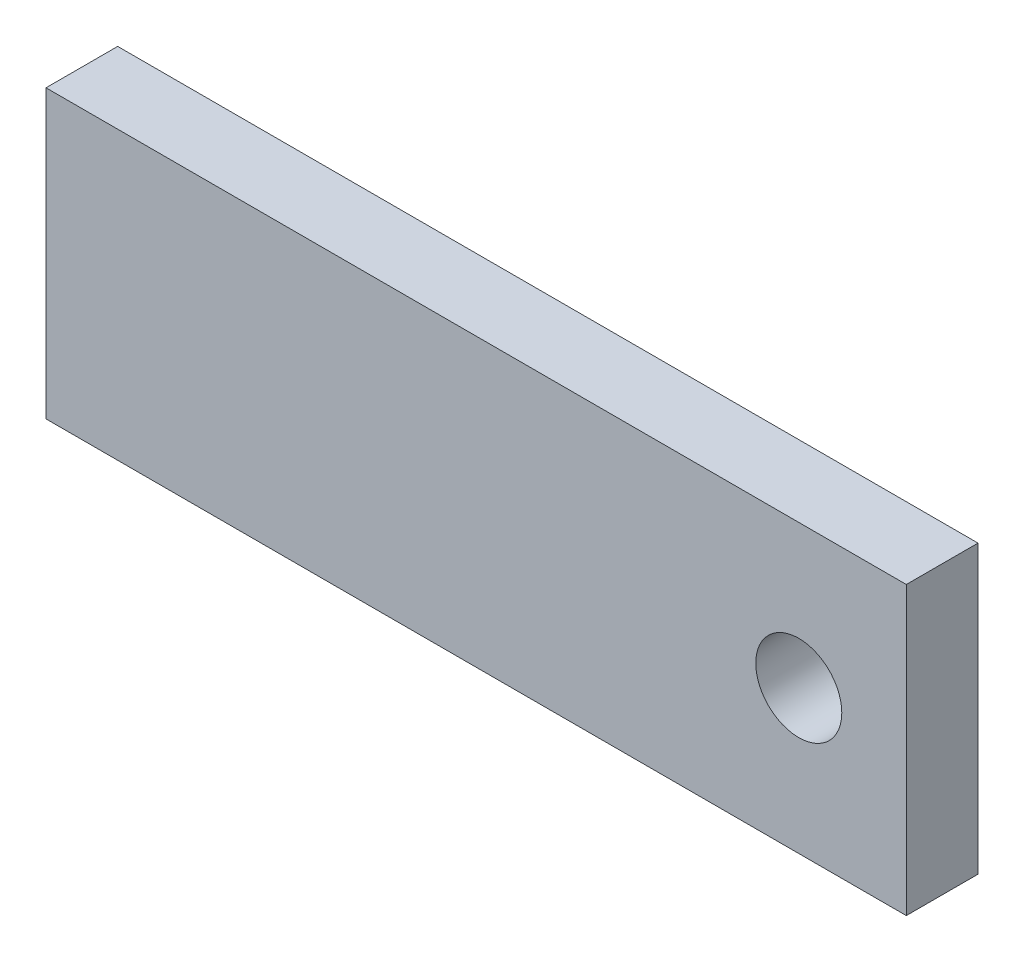
ISO-10303-21;
HEADER;
FILE_DESCRIPTION(('STEP AP214'),'2;1');
FILE_NAME('part.step','',(''),(''),'','','');
FILE_SCHEMA(('AUTOMOTIVE_DESIGN { 1 0 10303 214 1 1 1 1 }'));
ENDSEC;
DATA;
#1=APPLICATION_CONTEXT('core data for automotive mechanical design processes');
#2=APPLICATION_PROTOCOL_DEFINITION('international standard','automotive_design',2000,#1);
#3=PRODUCT_CONTEXT('',#1,'mechanical');
#4=PRODUCT('Part','Part','',(#3));
#5=PRODUCT_RELATED_PRODUCT_CATEGORY('part','',(#4));
#6=PRODUCT_DEFINITION_FORMATION('','',#4);
#7=PRODUCT_DEFINITION_CONTEXT('part definition',#1,'design');
#8=PRODUCT_DEFINITION('design','',#6,#7);
#9=PRODUCT_DEFINITION_SHAPE('','',#8);
#10=(LENGTH_UNIT() NAMED_UNIT(*) SI_UNIT(.MILLI.,.METRE.));
#11=(NAMED_UNIT(*) PLANE_ANGLE_UNIT() SI_UNIT($,.RADIAN.));
#12=(NAMED_UNIT(*) SI_UNIT($,.STERADIAN.) SOLID_ANGLE_UNIT());
#13=UNCERTAINTY_MEASURE_WITH_UNIT(LENGTH_MEASURE(1.E-05),#10,'distance_accuracy_value','');
#14=(GEOMETRIC_REPRESENTATION_CONTEXT(3) GLOBAL_UNCERTAINTY_ASSIGNED_CONTEXT((#13)) GLOBAL_UNIT_ASSIGNED_CONTEXT((#10,
#11,#12)) REPRESENTATION_CONTEXT('',''));
#15=CARTESIAN_POINT('',(0.,0.,0.));
#16=DIRECTION('',(0.,0.,1.));
#17=DIRECTION('',(1.,0.,0.));
#18=AXIS2_PLACEMENT_3D('',#15,#16,#17);
#19=CARTESIAN_POINT('',(0.,20.,10.));
#20=DIRECTION('',(1.,0.,0.));
#21=DIRECTION('',(0.,0.,-1.));
#22=AXIS2_PLACEMENT_3D('',#19,#20,#21);
#23=PLANE('',#22);
#24=DIRECTION('',(0.,-1.,0.));
#25=VECTOR('',#24,1.);
#26=CARTESIAN_POINT('',(0.,20.,0.));
#27=LINE('',#26,#25);
#28=CARTESIAN_POINT('',(0.,20.,0.));
#29=VERTEX_POINT('',#28);
#30=CARTESIAN_POINT('',(0.,-20.,0.));
#31=VERTEX_POINT('',#30);
#32=EDGE_CURVE('E96',#29,#31,#27,.T.);
#33=ORIENTED_EDGE('',*,*,#32,.T.);
#34=DIRECTION('',(0.,0.,-1.));
#35=VECTOR('',#34,1.);
#36=CARTESIAN_POINT('',(0.,-20.,10.));
#37=LINE('',#36,#35);
#38=CARTESIAN_POINT('',(0.,-20.,10.));
#39=VERTEX_POINT('',#38);
#40=EDGE_CURVE('E11',#39,#31,#37,.T.);
#41=ORIENTED_EDGE('',*,*,#40,.F.);
#42=DIRECTION('',(0.,-1.,0.));
#43=VECTOR('',#42,1.);
#44=CARTESIAN_POINT('',(0.,20.,10.));
#45=LINE('',#44,#43);
#46=CARTESIAN_POINT('',(0.,20.,10.));
#47=VERTEX_POINT('',#46);
#48=EDGE_CURVE('E84',#47,#39,#45,.T.);
#49=ORIENTED_EDGE('',*,*,#48,.F.);
#50=DIRECTION('',(0.,0.,-1.));
#51=VECTOR('',#50,1.);
#52=CARTESIAN_POINT('',(0.,20.,10.));
#53=LINE('',#52,#51);
#54=EDGE_CURVE('E92',#47,#29,#53,.T.);
#55=ORIENTED_EDGE('',*,*,#54,.T.);
#56=EDGE_LOOP('',(#33,#41,#49,#55));
#57=FACE_BOUND('',#56,.T.);
#58=ADVANCED_FACE('F33',(#57),#23,.F.);
#59=CARTESIAN_POINT('',(0.,-20.,10.));
#60=DIRECTION('',(0.,1.,0.));
#61=DIRECTION('',(0.,0.,1.));
#62=AXIS2_PLACEMENT_3D('',#59,#60,#61);
#63=PLANE('',#62);
#64=DIRECTION('',(1.,0.,0.));
#65=VECTOR('',#64,1.);
#66=CARTESIAN_POINT('',(0.,-20.,0.));
#67=LINE('',#66,#65);
#68=CARTESIAN_POINT('',(120.,-20.,0.));
#69=VERTEX_POINT('',#68);
#70=EDGE_CURVE('E88',#31,#69,#67,.T.);
#71=ORIENTED_EDGE('',*,*,#70,.T.);
#72=DIRECTION('',(0.,0.,-1.));
#73=VECTOR('',#72,1.);
#74=CARTESIAN_POINT('',(120.,-20.,10.));
#75=LINE('',#74,#73);
#76=CARTESIAN_POINT('',(120.,-20.,10.));
#77=VERTEX_POINT('',#76);
#78=EDGE_CURVE('E41',#77,#69,#75,.T.);
#79=ORIENTED_EDGE('',*,*,#78,.F.);
#80=DIRECTION('',(1.,0.,0.));
#81=VECTOR('',#80,1.);
#82=CARTESIAN_POINT('',(0.,-20.,10.));
#83=LINE('',#82,#81);
#84=EDGE_CURVE('E79',#39,#77,#83,.T.);
#85=ORIENTED_EDGE('',*,*,#84,.F.);
#86=ORIENTED_EDGE('',*,*,#40,.T.);
#87=EDGE_LOOP('',(#71,#79,#85,#86));
#88=FACE_BOUND('',#87,.T.);
#89=ADVANCED_FACE('F87',(#88),#63,.F.);
#90=CARTESIAN_POINT('',(120.,20.,10.));
#91=DIRECTION('',(-1.,0.,0.));
#92=DIRECTION('',(0.,0.,1.));
#93=AXIS2_PLACEMENT_3D('',#90,#91,#92);
#94=PLANE('',#93);
#95=DIRECTION('',(0.,1.,0.));
#96=VECTOR('',#95,1.);
#97=CARTESIAN_POINT('',(120.,20.,0.));
#98=LINE('',#97,#96);
#99=CARTESIAN_POINT('',(120.,20.,0.));
#100=VERTEX_POINT('',#99);
#101=EDGE_CURVE('E66',#69,#100,#98,.T.);
#102=ORIENTED_EDGE('',*,*,#101,.T.);
#103=DIRECTION('',(0.,0.,-1.));
#104=VECTOR('',#103,1.);
#105=CARTESIAN_POINT('',(120.,20.,10.));
#106=LINE('',#105,#104);
#107=CARTESIAN_POINT('',(120.,20.,10.));
#108=VERTEX_POINT('',#107);
#109=EDGE_CURVE('E89',#108,#100,#106,.T.);
#110=ORIENTED_EDGE('',*,*,#109,.F.);
#111=DIRECTION('',(0.,1.,0.));
#112=VECTOR('',#111,1.);
#113=CARTESIAN_POINT('',(120.,20.,10.));
#114=LINE('',#113,#112);
#115=EDGE_CURVE('E82',#77,#108,#114,.T.);
#116=ORIENTED_EDGE('',*,*,#115,.F.);
#117=ORIENTED_EDGE('',*,*,#78,.T.);
#118=EDGE_LOOP('',(#102,#110,#116,#117));
#119=FACE_BOUND('',#118,.T.);
#120=ADVANCED_FACE('F90',(#119),#94,.F.);
#121=CARTESIAN_POINT('',(0.,20.,10.));
#122=DIRECTION('',(0.,-1.,0.));
#123=DIRECTION('',(0.,0.,-1.));
#124=AXIS2_PLACEMENT_3D('',#121,#122,#123);
#125=PLANE('',#124);
#126=DIRECTION('',(-1.,0.,0.));
#127=VECTOR('',#126,1.);
#128=CARTESIAN_POINT('',(0.,20.,0.));
#129=LINE('',#128,#127);
#130=EDGE_CURVE('E72',#100,#29,#129,.T.);
#131=ORIENTED_EDGE('',*,*,#130,.T.);
#132=ORIENTED_EDGE('',*,*,#54,.F.);
#133=DIRECTION('',(-1.,0.,0.));
#134=VECTOR('',#133,1.);
#135=CARTESIAN_POINT('',(0.,20.,10.));
#136=LINE('',#135,#134);
#137=EDGE_CURVE('E49',#108,#47,#136,.T.);
#138=ORIENTED_EDGE('',*,*,#137,.F.);
#139=ORIENTED_EDGE('',*,*,#109,.T.);
#140=EDGE_LOOP('',(#131,#132,#138,#139));
#141=FACE_BOUND('',#140,.T.);
#142=ADVANCED_FACE('F104',(#141),#125,.F.);
#143=CARTESIAN_POINT('',(0.,0.,10.));
#144=DIRECTION('',(0.,0.,1.));
#145=DIRECTION('',(1.,0.,0.));
#146=AXIS2_PLACEMENT_3D('',#143,#144,#145);
#147=PLANE('',#146);
#148=CARTESIAN_POINT('',(105.,0.,10.));
#149=DIRECTION('',(0.,0.,1.));
#150=DIRECTION('',(1.,0.,0.));
#151=AXIS2_PLACEMENT_3D('',#148,#149,#150);
#152=CIRCLE('',#151,6.);
#153=CARTESIAN_POINT('',(111.,0.,10.));
#154=VERTEX_POINT('',#153);
#155=EDGE_CURVE('E110',#154,#154,#152,.T.);
#156=ORIENTED_EDGE('',*,*,#155,.F.);
#157=EDGE_LOOP('',(#156));
#158=FACE_BOUND('',#157,.T.);
#159=ORIENTED_EDGE('',*,*,#48,.T.);
#160=ORIENTED_EDGE('',*,*,#84,.T.);
#161=ORIENTED_EDGE('',*,*,#115,.T.);
#162=ORIENTED_EDGE('',*,*,#137,.T.);
#163=EDGE_LOOP('',(#159,#160,#161,#162));
#164=FACE_BOUND('',#163,.T.);
#165=ADVANCED_FACE('F80',(#158,#164),#147,.T.);
#166=CARTESIAN_POINT('',(0.,0.,0.));
#167=DIRECTION('',(0.,0.,1.));
#168=DIRECTION('',(1.,0.,0.));
#169=AXIS2_PLACEMENT_3D('',#166,#167,#168);
#170=PLANE('',#169);
#171=CARTESIAN_POINT('',(105.,0.,0.));
#172=DIRECTION('',(0.,0.,1.));
#173=DIRECTION('',(1.,0.,0.));
#174=AXIS2_PLACEMENT_3D('',#171,#172,#173);
#175=CIRCLE('',#174,6.);
#176=CARTESIAN_POINT('',(111.,0.,0.));
#177=VERTEX_POINT('',#176);
#178=EDGE_CURVE('E99',#177,#177,#175,.T.);
#179=ORIENTED_EDGE('',*,*,#178,.T.);
#180=EDGE_LOOP('',(#179));
#181=FACE_BOUND('',#180,.T.);
#182=ORIENTED_EDGE('',*,*,#32,.F.);
#183=ORIENTED_EDGE('',*,*,#130,.F.);
#184=ORIENTED_EDGE('',*,*,#101,.F.);
#185=ORIENTED_EDGE('',*,*,#70,.F.);
#186=EDGE_LOOP('',(#182,#183,#184,#185));
#187=FACE_BOUND('',#186,.T.);
#188=ADVANCED_FACE('F107',(#181,#187),#170,.F.);
#189=CARTESIAN_POINT('',(105.,0.,0.));
#190=DIRECTION('',(0.,0.,1.));
#191=DIRECTION('',(1.,0.,0.));
#192=AXIS2_PLACEMENT_3D('',#189,#190,#191);
#193=CYLINDRICAL_SURFACE('',#192,6.);
#194=ORIENTED_EDGE('',*,*,#178,.F.);
#195=EDGE_LOOP('',(#194));
#196=FACE_BOUND('',#195,.T.);
#197=ORIENTED_EDGE('',*,*,#155,.T.);
#198=EDGE_LOOP('',(#197));
#199=FACE_BOUND('',#198,.T.);
#200=ADVANCED_FACE('F117',(#196,#199),#193,.F.);
#201=CLOSED_SHELL('',(#58,#89,#120,#142,#165,#188,#200));
#202=MANIFOLD_SOLID_BREP('B2',#201);
#203=ADVANCED_BREP_SHAPE_REPRESENTATION('',(#18,#202),#14);
#204=SHAPE_DEFINITION_REPRESENTATION(#9,#203);
ENDSEC;
END-ISO-10303-21;
